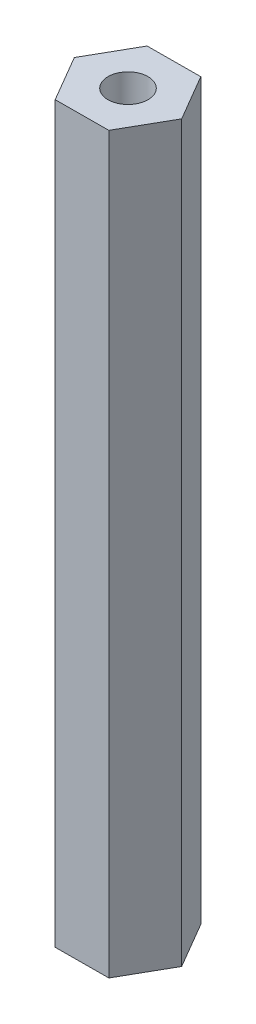
ISO-10303-21;
HEADER;
FILE_DESCRIPTION(('STEP AP214'),'2;1');
FILE_NAME('part.step','',(''),(''),'','','');
FILE_SCHEMA(('AUTOMOTIVE_DESIGN { 1 0 10303 214 1 1 1 1 }'));
ENDSEC;
DATA;
#1=APPLICATION_CONTEXT('core data for automotive mechanical design processes');
#2=APPLICATION_PROTOCOL_DEFINITION('international standard','automotive_design',2000,#1);
#3=PRODUCT_CONTEXT('',#1,'mechanical');
#4=PRODUCT('Part','Part','',(#3));
#5=PRODUCT_RELATED_PRODUCT_CATEGORY('part','',(#4));
#6=PRODUCT_DEFINITION_FORMATION('','',#4);
#7=PRODUCT_DEFINITION_CONTEXT('part definition',#1,'design');
#8=PRODUCT_DEFINITION('design','',#6,#7);
#9=PRODUCT_DEFINITION_SHAPE('','',#8);
#10=(LENGTH_UNIT() NAMED_UNIT(*) SI_UNIT(.MILLI.,.METRE.));
#11=(NAMED_UNIT(*) PLANE_ANGLE_UNIT() SI_UNIT($,.RADIAN.));
#12=(NAMED_UNIT(*) SI_UNIT($,.STERADIAN.) SOLID_ANGLE_UNIT());
#13=UNCERTAINTY_MEASURE_WITH_UNIT(LENGTH_MEASURE(1.E-05),#10,'distance_accuracy_value','');
#14=(GEOMETRIC_REPRESENTATION_CONTEXT(3) GLOBAL_UNCERTAINTY_ASSIGNED_CONTEXT((#13)) GLOBAL_UNIT_ASSIGNED_CONTEXT((#10,
#11,#12)) REPRESENTATION_CONTEXT('',''));
#15=CARTESIAN_POINT('',(0.,0.,0.));
#16=DIRECTION('',(0.,0.,1.));
#17=DIRECTION('',(1.,0.,0.));
#18=AXIS2_PLACEMENT_3D('',#15,#16,#17);
#19=CARTESIAN_POINT('',(0.,55.,0.));
#20=DIRECTION('',(0.,1.,0.));
#21=DIRECTION('',(0.,0.,1.));
#22=AXIS2_PLACEMENT_3D('',#19,#20,#21);
#23=PLANE('',#22);
#24=DIRECTION('',(0.504720772285242,0.,0.863282654768291));
#25=VECTOR('',#24,1.);
#26=CARTESIAN_POINT('',(-3.99994038327374,55.,0.0218387329302984));
#27=LINE('',#26,#25);
#28=CARTESIAN_POINT('',(-3.99994038327374,55.,0.0218387329302984));
#29=VERTEX_POINT('',#28);
#30=CARTESIAN_POINT('',(-1.98105729413277,55.,3.47496935200347));
#31=VERTEX_POINT('',#30);
#32=EDGE_CURVE('E131',#29,#31,#27,.T.);
#33=ORIENTED_EDGE('',*,*,#32,.T.);
#34=DIRECTION('',(0.999985095818433,0.,-0.00545968323257411));
#35=VECTOR('',#34,1.);
#36=CARTESIAN_POINT('',(-1.98105729413277,55.,3.47496935200347));
#37=LINE('',#36,#35);
#38=CARTESIAN_POINT('',(2.01888308914097,55.,3.45313061907317));
#39=VERTEX_POINT('',#38);
#40=EDGE_CURVE('E89',#31,#39,#37,.T.);
#41=ORIENTED_EDGE('',*,*,#40,.T.);
#42=DIRECTION('',(0.495264323533191,0.,-0.868742338000866));
#43=VECTOR('',#42,1.);
#44=CARTESIAN_POINT('',(2.01888308914097,55.,3.45313061907317));
#45=LINE('',#44,#43);
#46=CARTESIAN_POINT('',(3.99994038327374,55.,-0.0218387329302983));
#47=VERTEX_POINT('',#46);
#48=EDGE_CURVE('E102',#39,#47,#45,.T.);
#49=ORIENTED_EDGE('',*,*,#48,.T.);
#50=DIRECTION('',(-0.504720772285242,0.,-0.863282654768292));
#51=VECTOR('',#50,1.);
#52=CARTESIAN_POINT('',(3.99994038327374,55.,-0.0218387329302983));
#53=LINE('',#52,#51);
#54=CARTESIAN_POINT('',(1.98105729413277,55.,-3.47496935200347));
#55=VERTEX_POINT('',#54);
#56=EDGE_CURVE('E96',#47,#55,#53,.T.);
#57=ORIENTED_EDGE('',*,*,#56,.T.);
#58=DIRECTION('',(-0.999985095818433,0.,0.00545968323257432));
#59=VECTOR('',#58,1.);
#60=CARTESIAN_POINT('',(1.98105729413277,55.,-3.47496935200347));
#61=LINE('',#60,#59);
#62=CARTESIAN_POINT('',(-2.01888308914097,55.,-3.45313061907317));
#63=VERTEX_POINT('',#62);
#64=EDGE_CURVE('E100',#55,#63,#61,.T.);
#65=ORIENTED_EDGE('',*,*,#64,.T.);
#66=DIRECTION('',(-0.495264323533191,0.,0.868742338000866));
#67=VECTOR('',#66,1.);
#68=CARTESIAN_POINT('',(-2.01888308914097,55.,-3.45313061907317));
#69=LINE('',#68,#67);
#70=EDGE_CURVE('E52',#63,#29,#69,.T.);
#71=ORIENTED_EDGE('',*,*,#70,.T.);
#72=EDGE_LOOP('',(#33,#41,#49,#57,#65,#71));
#73=FACE_BOUND('',#72,.T.);
#74=CARTESIAN_POINT('',(0.,55.,0.));
#75=DIRECTION('',(0.,1.,0.));
#76=DIRECTION('',(0.,0.,1.));
#77=AXIS2_PLACEMENT_3D('',#74,#75,#76);
#78=CIRCLE('',#77,1.5);
#79=CARTESIAN_POINT('',(0.,55.,1.5));
#80=VERTEX_POINT('',#79);
#81=EDGE_CURVE('E124',#80,#80,#78,.T.);
#82=ORIENTED_EDGE('',*,*,#81,.F.);
#83=EDGE_LOOP('',(#82));
#84=FACE_BOUND('',#83,.T.);
#85=ADVANCED_FACE('F35',(#73,#84),#23,.T.);
#86=CARTESIAN_POINT('',(0.,0.,0.));
#87=DIRECTION('',(0.,1.,0.));
#88=DIRECTION('',(0.,0.,1.));
#89=AXIS2_PLACEMENT_3D('',#86,#87,#88);
#90=PLANE('',#89);
#91=DIRECTION('',(0.504720772285242,0.,0.863282654768291));
#92=VECTOR('',#91,1.);
#93=CARTESIAN_POINT('',(-3.99994038327374,0.,0.0218387329302984));
#94=LINE('',#93,#92);
#95=CARTESIAN_POINT('',(-3.99994038327374,0.,0.0218387329302984));
#96=VERTEX_POINT('',#95);
#97=CARTESIAN_POINT('',(-1.98105729413277,0.,3.47496935200347));
#98=VERTEX_POINT('',#97);
#99=EDGE_CURVE('E120',#96,#98,#94,.T.);
#100=ORIENTED_EDGE('',*,*,#99,.F.);
#101=DIRECTION('',(-0.495264323533191,0.,0.868742338000866));
#102=VECTOR('',#101,1.);
#103=CARTESIAN_POINT('',(-2.01888308914097,0.,-3.45313061907317));
#104=LINE('',#103,#102);
#105=CARTESIAN_POINT('',(-2.01888308914097,0.,-3.45313061907317));
#106=VERTEX_POINT('',#105);
#107=EDGE_CURVE('E81',#106,#96,#104,.T.);
#108=ORIENTED_EDGE('',*,*,#107,.F.);
#109=DIRECTION('',(-0.999985095818433,0.,0.00545968323257432));
#110=VECTOR('',#109,1.);
#111=CARTESIAN_POINT('',(1.98105729413277,0.,-3.47496935200347));
#112=LINE('',#111,#110);
#113=CARTESIAN_POINT('',(1.98105729413277,0.,-3.47496935200347));
#114=VERTEX_POINT('',#113);
#115=EDGE_CURVE('E75',#114,#106,#112,.T.);
#116=ORIENTED_EDGE('',*,*,#115,.F.);
#117=DIRECTION('',(-0.504720772285242,0.,-0.863282654768292));
#118=VECTOR('',#117,1.);
#119=CARTESIAN_POINT('',(3.99994038327374,0.,-0.0218387329302983));
#120=LINE('',#119,#118);
#121=CARTESIAN_POINT('',(3.99994038327374,0.,-0.0218387329302983));
#122=VERTEX_POINT('',#121);
#123=EDGE_CURVE('E110',#122,#114,#120,.T.);
#124=ORIENTED_EDGE('',*,*,#123,.F.);
#125=DIRECTION('',(0.495264323533191,0.,-0.868742338000866));
#126=VECTOR('',#125,1.);
#127=CARTESIAN_POINT('',(2.01888308914097,0.,3.45313061907317));
#128=LINE('',#127,#126);
#129=CARTESIAN_POINT('',(2.01888308914097,0.,3.45313061907317));
#130=VERTEX_POINT('',#129);
#131=EDGE_CURVE('E126',#130,#122,#128,.T.);
#132=ORIENTED_EDGE('',*,*,#131,.F.);
#133=DIRECTION('',(0.999985095818433,0.,-0.00545968323257411));
#134=VECTOR('',#133,1.);
#135=CARTESIAN_POINT('',(-1.98105729413277,0.,3.47496935200347));
#136=LINE('',#135,#134);
#137=EDGE_CURVE('E123',#98,#130,#136,.T.);
#138=ORIENTED_EDGE('',*,*,#137,.F.);
#139=EDGE_LOOP('',(#100,#108,#116,#124,#132,#138));
#140=FACE_BOUND('',#139,.T.);
#141=CARTESIAN_POINT('',(0.,0.,0.));
#142=DIRECTION('',(0.,1.,0.));
#143=DIRECTION('',(0.,0.,1.));
#144=AXIS2_PLACEMENT_3D('',#141,#142,#143);
#145=CIRCLE('',#144,1.5);
#146=CARTESIAN_POINT('',(0.,0.,1.5));
#147=VERTEX_POINT('',#146);
#148=EDGE_CURVE('E224',#147,#147,#145,.T.);
#149=ORIENTED_EDGE('',*,*,#148,.T.);
#150=EDGE_LOOP('',(#149));
#151=FACE_BOUND('',#150,.T.);
#152=ADVANCED_FACE('F140',(#140,#151),#90,.F.);
#153=CARTESIAN_POINT('',(-3.99994038327374,55.,0.0218387329302984));
#154=DIRECTION('',(0.863282654768291,0.,-0.504720772285242));
#155=DIRECTION('',(-0.504720772285242,0.,-0.863282654768291));
#156=AXIS2_PLACEMENT_3D('',#153,#154,#155);
#157=PLANE('',#156);
#158=ORIENTED_EDGE('',*,*,#99,.T.);
#159=DIRECTION('',(0.,-1.,0.));
#160=VECTOR('',#159,1.);
#161=CARTESIAN_POINT('',(-1.98105729413277,55.,3.47496935200347));
#162=LINE('',#161,#160);
#163=EDGE_CURVE('E11',#31,#98,#162,.T.);
#164=ORIENTED_EDGE('',*,*,#163,.F.);
#165=ORIENTED_EDGE('',*,*,#32,.F.);
#166=DIRECTION('',(0.,-1.,0.));
#167=VECTOR('',#166,1.);
#168=CARTESIAN_POINT('',(-3.99994038327374,55.,0.0218387329302984));
#169=LINE('',#168,#167);
#170=EDGE_CURVE('E116',#29,#96,#169,.T.);
#171=ORIENTED_EDGE('',*,*,#170,.T.);
#172=EDGE_LOOP('',(#158,#164,#165,#171));
#173=FACE_BOUND('',#172,.T.);
#174=ADVANCED_FACE('F37',(#173),#157,.F.);
#175=CARTESIAN_POINT('',(-1.98105729413277,55.,3.47496935200347));
#176=DIRECTION('',(-0.00545968323257411,0.,-0.999985095818433));
#177=DIRECTION('',(-0.999985095818433,0.,0.00545968323257411));
#178=AXIS2_PLACEMENT_3D('',#175,#176,#177);
#179=PLANE('',#178);
#180=ORIENTED_EDGE('',*,*,#137,.T.);
#181=DIRECTION('',(0.,-1.,0.));
#182=VECTOR('',#181,1.);
#183=CARTESIAN_POINT('',(2.01888308914097,55.,3.45313061907317));
#184=LINE('',#183,#182);
#185=EDGE_CURVE('E44',#39,#130,#184,.T.);
#186=ORIENTED_EDGE('',*,*,#185,.F.);
#187=ORIENTED_EDGE('',*,*,#40,.F.);
#188=ORIENTED_EDGE('',*,*,#163,.T.);
#189=EDGE_LOOP('',(#180,#186,#187,#188));
#190=FACE_BOUND('',#189,.T.);
#191=ADVANCED_FACE('F165',(#190),#179,.F.);
#192=CARTESIAN_POINT('',(2.01888308914097,55.,3.45313061907317));
#193=DIRECTION('',(-0.868742338000866,0.,-0.495264323533191));
#194=DIRECTION('',(-0.495264323533191,0.,0.868742338000866));
#195=AXIS2_PLACEMENT_3D('',#192,#193,#194);
#196=PLANE('',#195);
#197=ORIENTED_EDGE('',*,*,#131,.T.);
#198=DIRECTION('',(0.,-1.,0.));
#199=VECTOR('',#198,1.);
#200=CARTESIAN_POINT('',(3.99994038327374,55.,-0.0218387329302983));
#201=LINE('',#200,#199);
#202=EDGE_CURVE('E111',#47,#122,#201,.T.);
#203=ORIENTED_EDGE('',*,*,#202,.F.);
#204=ORIENTED_EDGE('',*,*,#48,.F.);
#205=ORIENTED_EDGE('',*,*,#185,.T.);
#206=EDGE_LOOP('',(#197,#203,#204,#205));
#207=FACE_BOUND('',#206,.T.);
#208=ADVANCED_FACE('F137',(#207),#196,.F.);
#209=CARTESIAN_POINT('',(3.99994038327374,55.,-0.0218387329302983));
#210=DIRECTION('',(-0.863282654768292,0.,0.504720772285242));
#211=DIRECTION('',(0.504720772285242,0.,0.863282654768292));
#212=AXIS2_PLACEMENT_3D('',#209,#210,#211);
#213=PLANE('',#212);
#214=ORIENTED_EDGE('',*,*,#123,.T.);
#215=DIRECTION('',(0.,-1.,0.));
#216=VECTOR('',#215,1.);
#217=CARTESIAN_POINT('',(1.98105729413277,55.,-3.47496935200347));
#218=LINE('',#217,#216);
#219=EDGE_CURVE('E107',#55,#114,#218,.T.);
#220=ORIENTED_EDGE('',*,*,#219,.F.);
#221=ORIENTED_EDGE('',*,*,#56,.F.);
#222=ORIENTED_EDGE('',*,*,#202,.T.);
#223=EDGE_LOOP('',(#214,#220,#221,#222));
#224=FACE_BOUND('',#223,.T.);
#225=ADVANCED_FACE('F108',(#224),#213,.F.);
#226=CARTESIAN_POINT('',(1.98105729413277,55.,-3.47496935200347));
#227=DIRECTION('',(0.00545968323257432,0.,0.999985095818433));
#228=DIRECTION('',(0.999985095818433,0.,-0.00545968323257432));
#229=AXIS2_PLACEMENT_3D('',#226,#227,#228);
#230=PLANE('',#229);
#231=ORIENTED_EDGE('',*,*,#115,.T.);
#232=DIRECTION('',(0.,-1.,0.));
#233=VECTOR('',#232,1.);
#234=CARTESIAN_POINT('',(-2.01888308914097,55.,-3.45313061907317));
#235=LINE('',#234,#233);
#236=EDGE_CURVE('E112',#63,#106,#235,.T.);
#237=ORIENTED_EDGE('',*,*,#236,.F.);
#238=ORIENTED_EDGE('',*,*,#64,.F.);
#239=ORIENTED_EDGE('',*,*,#219,.T.);
#240=EDGE_LOOP('',(#231,#237,#238,#239));
#241=FACE_BOUND('',#240,.T.);
#242=ADVANCED_FACE('F114',(#241),#230,.F.);
#243=CARTESIAN_POINT('',(-2.01888308914097,55.,-3.45313061907317));
#244=DIRECTION('',(0.868742338000866,0.,0.495264323533191));
#245=DIRECTION('',(0.495264323533191,0.,-0.868742338000866));
#246=AXIS2_PLACEMENT_3D('',#243,#244,#245);
#247=PLANE('',#246);
#248=ORIENTED_EDGE('',*,*,#107,.T.);
#249=ORIENTED_EDGE('',*,*,#170,.F.);
#250=ORIENTED_EDGE('',*,*,#70,.F.);
#251=ORIENTED_EDGE('',*,*,#236,.T.);
#252=EDGE_LOOP('',(#248,#249,#250,#251));
#253=FACE_BOUND('',#252,.T.);
#254=ADVANCED_FACE('F145',(#253),#247,.F.);
#255=CARTESIAN_POINT('',(0.,55.,0.));
#256=DIRECTION('',(0.,-1.,0.));
#257=DIRECTION('',(0.,0.,-1.));
#258=AXIS2_PLACEMENT_3D('',#255,#256,#257);
#259=CYLINDRICAL_SURFACE('',#258,1.5);
#260=ORIENTED_EDGE('',*,*,#81,.T.);
#261=EDGE_LOOP('',(#260));
#262=FACE_BOUND('',#261,.T.);
#263=ORIENTED_EDGE('',*,*,#148,.F.);
#264=EDGE_LOOP('',(#263));
#265=FACE_BOUND('',#264,.T.);
#266=ADVANCED_FACE('F147',(#262,#265),#259,.F.);
#267=CLOSED_SHELL('',(#85,#152,#174,#191,#208,#225,#242,#254,#266));
#268=MANIFOLD_SOLID_BREP('B2',#267);
#269=ADVANCED_BREP_SHAPE_REPRESENTATION('',(#18,#268),#14);
#270=SHAPE_DEFINITION_REPRESENTATION(#9,#269);
ENDSEC;
END-ISO-10303-21;
